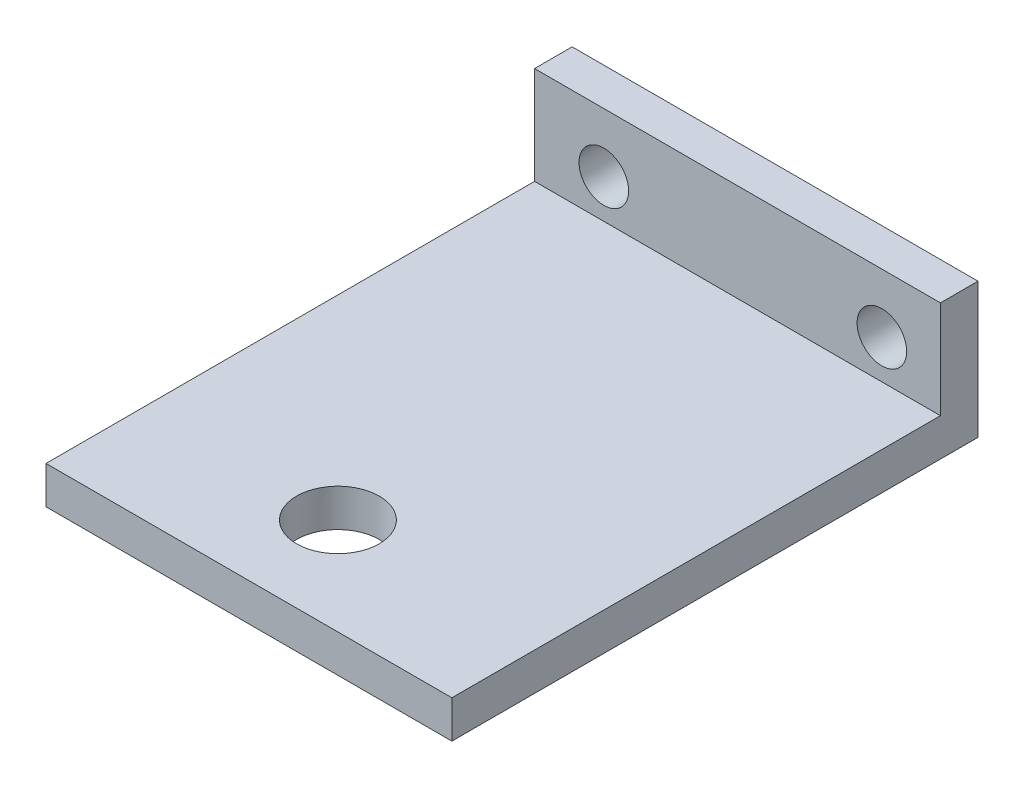
ISO-10303-21;
HEADER;
FILE_DESCRIPTION(('STEP AP214'),'2;1');
FILE_NAME('part.step','',(''),(''),'','','');
FILE_SCHEMA(('AUTOMOTIVE_DESIGN { 1 0 10303 214 1 1 1 1 }'));
ENDSEC;
DATA;
#1=APPLICATION_CONTEXT('core data for automotive mechanical design processes');
#2=APPLICATION_PROTOCOL_DEFINITION('international standard','automotive_design',2000,#1);
#3=PRODUCT_CONTEXT('',#1,'mechanical');
#4=PRODUCT('Part','Part','',(#3));
#5=PRODUCT_RELATED_PRODUCT_CATEGORY('part','',(#4));
#6=PRODUCT_DEFINITION_FORMATION('','',#4);
#7=PRODUCT_DEFINITION_CONTEXT('part definition',#1,'design');
#8=PRODUCT_DEFINITION('design','',#6,#7);
#9=PRODUCT_DEFINITION_SHAPE('','',#8);
#10=(LENGTH_UNIT() NAMED_UNIT(*) SI_UNIT(.MILLI.,.METRE.));
#11=(NAMED_UNIT(*) PLANE_ANGLE_UNIT() SI_UNIT($,.RADIAN.));
#12=(NAMED_UNIT(*) SI_UNIT($,.STERADIAN.) SOLID_ANGLE_UNIT());
#13=UNCERTAINTY_MEASURE_WITH_UNIT(LENGTH_MEASURE(1.E-05),#10,'distance_accuracy_value','');
#14=(GEOMETRIC_REPRESENTATION_CONTEXT(3) GLOBAL_UNCERTAINTY_ASSIGNED_CONTEXT((#13)) GLOBAL_UNIT_ASSIGNED_CONTEXT((#10,
#11,#12)) REPRESENTATION_CONTEXT('',''));
#15=CARTESIAN_POINT('',(0.,0.,0.));
#16=DIRECTION('',(0.,0.,1.));
#17=DIRECTION('',(1.,0.,0.));
#18=AXIS2_PLACEMENT_3D('',#15,#16,#17);
#19=CARTESIAN_POINT('',(0.,0.,70.));
#20=DIRECTION('',(0.,0.,-1.));
#21=DIRECTION('',(-1.,0.,0.));
#22=AXIS2_PLACEMENT_3D('',#19,#20,#21);
#23=PLANE('',#22);
#24=DIRECTION('',(1.,0.,0.));
#25=VECTOR('',#24,1.);
#26=CARTESIAN_POINT('',(0.,-4.,70.));
#27=LINE('',#26,#25);
#28=CARTESIAN_POINT('',(-27.,-4.,70.));
#29=VERTEX_POINT('',#28);
#30=CARTESIAN_POINT('',(27.,-4.,70.));
#31=VERTEX_POINT('',#30);
#32=EDGE_CURVE('E43',#29,#31,#27,.T.);
#33=ORIENTED_EDGE('',*,*,#32,.F.);
#34=DIRECTION('',(0.,-1.,0.));
#35=VECTOR('',#34,1.);
#36=CARTESIAN_POINT('',(-27.,-8.99999999999999,70.));
#37=LINE('',#36,#35);
#38=CARTESIAN_POINT('',(-27.,-8.99999999999999,70.));
#39=VERTEX_POINT('',#38);
#40=EDGE_CURVE('E123',#29,#39,#37,.T.);
#41=ORIENTED_EDGE('',*,*,#40,.T.);
#42=DIRECTION('',(1.,0.,0.));
#43=VECTOR('',#42,1.);
#44=CARTESIAN_POINT('',(-27.,-8.99999999999999,70.));
#45=LINE('',#44,#43);
#46=CARTESIAN_POINT('',(27.,-8.99999999999999,70.));
#47=VERTEX_POINT('',#46);
#48=EDGE_CURVE('E59',#39,#47,#45,.T.);
#49=ORIENTED_EDGE('',*,*,#48,.T.);
#50=DIRECTION('',(0.,1.,0.));
#51=VECTOR('',#50,1.);
#52=CARTESIAN_POINT('',(27.,-8.99999999999999,70.));
#53=LINE('',#52,#51);
#54=EDGE_CURVE('E88',#47,#31,#53,.T.);
#55=ORIENTED_EDGE('',*,*,#54,.T.);
#56=EDGE_LOOP('',(#33,#41,#49,#55));
#57=FACE_BOUND('',#56,.T.);
#58=ADVANCED_FACE('F35',(#57),#23,.F.);
#59=CARTESIAN_POINT('',(27.,-8.99999999999999,70.));
#60=DIRECTION('',(-1.,0.,0.));
#61=DIRECTION('',(0.,0.,1.));
#62=AXIS2_PLACEMENT_3D('',#59,#60,#61);
#63=PLANE('',#62);
#64=DIRECTION('',(0.,0.,-1.));
#65=VECTOR('',#64,1.);
#66=CARTESIAN_POINT('',(27.,9.,70.));
#67=LINE('',#66,#65);
#68=CARTESIAN_POINT('',(27.,9.,5.));
#69=VERTEX_POINT('',#68);
#70=CARTESIAN_POINT('',(27.,9.,0.));
#71=VERTEX_POINT('',#70);
#72=EDGE_CURVE('E114',#69,#71,#67,.T.);
#73=ORIENTED_EDGE('',*,*,#72,.F.);
#74=DIRECTION('',(0.,-1.,0.));
#75=VECTOR('',#74,1.);
#76=CARTESIAN_POINT('',(27.,-8.99999999999999,5.));
#77=LINE('',#76,#75);
#78=CARTESIAN_POINT('',(27.,-4.,5.));
#79=VERTEX_POINT('',#78);
#80=EDGE_CURVE('E101',#69,#79,#77,.T.);
#81=ORIENTED_EDGE('',*,*,#80,.T.);
#82=DIRECTION('',(0.,0.,-1.));
#83=VECTOR('',#82,1.);
#84=CARTESIAN_POINT('',(27.,-4.,70.));
#85=LINE('',#84,#83);
#86=EDGE_CURVE('E105',#31,#79,#85,.T.);
#87=ORIENTED_EDGE('',*,*,#86,.F.);
#88=ORIENTED_EDGE('',*,*,#54,.F.);
#89=DIRECTION('',(0.,0.,-1.));
#90=VECTOR('',#89,1.);
#91=CARTESIAN_POINT('',(27.,-8.99999999999999,70.));
#92=LINE('',#91,#90);
#93=CARTESIAN_POINT('',(27.,-8.99999999999999,0.));
#94=VERTEX_POINT('',#93);
#95=EDGE_CURVE('E81',#47,#94,#92,.T.);
#96=ORIENTED_EDGE('',*,*,#95,.T.);
#97=DIRECTION('',(0.,1.,0.));
#98=VECTOR('',#97,1.);
#99=CARTESIAN_POINT('',(27.,-8.99999999999999,0.));
#100=LINE('',#99,#98);
#101=EDGE_CURVE('E94',#94,#71,#100,.T.);
#102=ORIENTED_EDGE('',*,*,#101,.T.);
#103=EDGE_LOOP('',(#73,#81,#87,#88,#96,#102));
#104=FACE_BOUND('',#103,.T.);
#105=ADVANCED_FACE('F37',(#104),#63,.F.);
#106=CARTESIAN_POINT('',(-27.,9.,70.));
#107=DIRECTION('',(0.,-1.,0.));
#108=DIRECTION('',(0.,0.,-1.));
#109=AXIS2_PLACEMENT_3D('',#106,#107,#108);
#110=PLANE('',#109);
#111=DIRECTION('',(0.,0.,-1.));
#112=VECTOR('',#111,1.);
#113=CARTESIAN_POINT('',(-27.,9.,70.));
#114=LINE('',#113,#112);
#115=CARTESIAN_POINT('',(-27.,9.,5.));
#116=VERTEX_POINT('',#115);
#117=CARTESIAN_POINT('',(-27.,9.,0.));
#118=VERTEX_POINT('',#117);
#119=EDGE_CURVE('E112',#116,#118,#114,.T.);
#120=ORIENTED_EDGE('',*,*,#119,.F.);
#121=DIRECTION('',(-1.,0.,0.));
#122=VECTOR('',#121,1.);
#123=CARTESIAN_POINT('',(42.5059230736906,9.,5.));
#124=LINE('',#123,#122);
#125=EDGE_CURVE('E128',#69,#116,#124,.T.);
#126=ORIENTED_EDGE('',*,*,#125,.F.);
#127=ORIENTED_EDGE('',*,*,#72,.T.);
#128=DIRECTION('',(-1.,0.,0.));
#129=VECTOR('',#128,1.);
#130=CARTESIAN_POINT('',(-27.,9.,0.));
#131=LINE('',#130,#129);
#132=EDGE_CURVE('E100',#71,#118,#131,.T.);
#133=ORIENTED_EDGE('',*,*,#132,.T.);
#134=EDGE_LOOP('',(#120,#126,#127,#133));
#135=FACE_BOUND('',#134,.T.);
#136=ADVANCED_FACE('F165',(#135),#110,.F.);
#137=CARTESIAN_POINT('',(-27.,-8.99999999999999,70.));
#138=DIRECTION('',(1.,0.,0.));
#139=DIRECTION('',(0.,0.,-1.));
#140=AXIS2_PLACEMENT_3D('',#137,#138,#139);
#141=PLANE('',#140);
#142=DIRECTION('',(0.,0.,1.));
#143=VECTOR('',#142,1.);
#144=CARTESIAN_POINT('',(-27.,-4.,70.));
#145=LINE('',#144,#143);
#146=CARTESIAN_POINT('',(-27.,-4.,5.));
#147=VERTEX_POINT('',#146);
#148=EDGE_CURVE('E50',#147,#29,#145,.T.);
#149=ORIENTED_EDGE('',*,*,#148,.F.);
#150=DIRECTION('',(0.,1.,0.));
#151=VECTOR('',#150,1.);
#152=CARTESIAN_POINT('',(-27.,-8.99999999999999,5.));
#153=LINE('',#152,#151);
#154=EDGE_CURVE('E11',#147,#116,#153,.T.);
#155=ORIENTED_EDGE('',*,*,#154,.T.);
#156=ORIENTED_EDGE('',*,*,#119,.T.);
#157=DIRECTION('',(0.,-1.,0.));
#158=VECTOR('',#157,1.);
#159=CARTESIAN_POINT('',(-27.,-8.99999999999999,0.));
#160=LINE('',#159,#158);
#161=CARTESIAN_POINT('',(-27.,-8.99999999999999,0.));
#162=VERTEX_POINT('',#161);
#163=EDGE_CURVE('E89',#118,#162,#160,.T.);
#164=ORIENTED_EDGE('',*,*,#163,.T.);
#165=DIRECTION('',(0.,0.,-1.));
#166=VECTOR('',#165,1.);
#167=CARTESIAN_POINT('',(-27.,-8.99999999999999,70.));
#168=LINE('',#167,#166);
#169=EDGE_CURVE('E84',#39,#162,#168,.T.);
#170=ORIENTED_EDGE('',*,*,#169,.F.);
#171=ORIENTED_EDGE('',*,*,#40,.F.);
#172=EDGE_LOOP('',(#149,#155,#156,#164,#170,#171));
#173=FACE_BOUND('',#172,.T.);
#174=ADVANCED_FACE('F154',(#173),#141,.F.);
#175=CARTESIAN_POINT('',(-27.,-8.99999999999999,70.));
#176=DIRECTION('',(0.,1.,0.));
#177=DIRECTION('',(0.,0.,1.));
#178=AXIS2_PLACEMENT_3D('',#175,#176,#177);
#179=PLANE('',#178);
#180=CARTESIAN_POINT('',(-1.0698050600705,-8.99999999999999,57.0922104987842));
#181=DIRECTION('',(0.,-1.,0.));
#182=DIRECTION('',(0.,0.,-1.));
#183=AXIS2_PLACEMENT_3D('',#180,#181,#182);
#184=CIRCLE('',#183,5.5);
#185=CARTESIAN_POINT('',(-1.0698050600705,-8.99999999999999,51.5922104987842));
#186=VERTEX_POINT('',#185);
#187=EDGE_CURVE('E147',#186,#186,#184,.T.);
#188=ORIENTED_EDGE('',*,*,#187,.F.);
#189=EDGE_LOOP('',(#188));
#190=FACE_BOUND('',#189,.T.);
#191=DIRECTION('',(1.,0.,0.));
#192=VECTOR('',#191,1.);
#193=CARTESIAN_POINT('',(-27.,-8.99999999999999,0.));
#194=LINE('',#193,#192);
#195=EDGE_CURVE('E78',#162,#94,#194,.T.);
#196=ORIENTED_EDGE('',*,*,#195,.T.);
#197=ORIENTED_EDGE('',*,*,#95,.F.);
#198=ORIENTED_EDGE('',*,*,#48,.F.);
#199=ORIENTED_EDGE('',*,*,#169,.T.);
#200=EDGE_LOOP('',(#196,#197,#198,#199));
#201=FACE_BOUND('',#200,.T.);
#202=ADVANCED_FACE('F80',(#190,#201),#179,.F.);
#203=CARTESIAN_POINT('',(0.,0.,0.));
#204=DIRECTION('',(0.,0.,-1.));
#205=DIRECTION('',(-1.,0.,0.));
#206=AXIS2_PLACEMENT_3D('',#203,#204,#205);
#207=PLANE('',#206);
#208=CARTESIAN_POINT('',(19.2116306925207,1.14474678496368,0.));
#209=DIRECTION('',(0.,0.,1.));
#210=DIRECTION('',(1.,0.,0.));
#211=AXIS2_PLACEMENT_3D('',#208,#209,#210);
#212=CIRCLE('',#211,3.3);
#213=CARTESIAN_POINT('',(22.5116306925207,1.14474678496368,0.));
#214=VERTEX_POINT('',#213);
#215=EDGE_CURVE('E138',#214,#214,#212,.T.);
#216=ORIENTED_EDGE('',*,*,#215,.T.);
#217=EDGE_LOOP('',(#216));
#218=FACE_BOUND('',#217,.T.);
#219=CARTESIAN_POINT('',(-17.7824036570975,1.14474678496368,0.));
#220=DIRECTION('',(0.,0.,1.));
#221=DIRECTION('',(1.,0.,0.));
#222=AXIS2_PLACEMENT_3D('',#219,#220,#221);
#223=CIRCLE('',#222,3.3);
#224=CARTESIAN_POINT('',(-14.4824036570975,1.14474678496368,0.));
#225=VERTEX_POINT('',#224);
#226=EDGE_CURVE('E131',#225,#225,#223,.T.);
#227=ORIENTED_EDGE('',*,*,#226,.T.);
#228=EDGE_LOOP('',(#227));
#229=FACE_BOUND('',#228,.T.);
#230=ORIENTED_EDGE('',*,*,#101,.F.);
#231=ORIENTED_EDGE('',*,*,#195,.F.);
#232=ORIENTED_EDGE('',*,*,#163,.F.);
#233=ORIENTED_EDGE('',*,*,#132,.F.);
#234=EDGE_LOOP('',(#230,#231,#232,#233));
#235=FACE_BOUND('',#234,.T.);
#236=ADVANCED_FACE('F98',(#218,#229,#235),#207,.T.);
#237=CARTESIAN_POINT('',(42.5059230736906,-4.,5.));
#238=DIRECTION('',(0.,0.,-1.));
#239=DIRECTION('',(-1.,0.,0.));
#240=AXIS2_PLACEMENT_3D('',#237,#238,#239);
#241=PLANE('',#240);
#242=CARTESIAN_POINT('',(19.2116306925207,1.14474678496368,5.));
#243=DIRECTION('',(0.,0.,1.));
#244=DIRECTION('',(1.,0.,0.));
#245=AXIS2_PLACEMENT_3D('',#242,#243,#244);
#246=CIRCLE('',#245,3.29999999999999);
#247=CARTESIAN_POINT('',(22.5116306925207,1.14474678496368,5.));
#248=VERTEX_POINT('',#247);
#249=EDGE_CURVE('E141',#248,#248,#246,.T.);
#250=ORIENTED_EDGE('',*,*,#249,.F.);
#251=EDGE_LOOP('',(#250));
#252=FACE_BOUND('',#251,.T.);
#253=CARTESIAN_POINT('',(-17.7824036570975,1.14474678496368,5.));
#254=DIRECTION('',(0.,0.,1.));
#255=DIRECTION('',(1.,0.,0.));
#256=AXIS2_PLACEMENT_3D('',#253,#254,#255);
#257=CIRCLE('',#256,3.29999999999999);
#258=CARTESIAN_POINT('',(-14.4824036570975,1.14474678496368,5.));
#259=VERTEX_POINT('',#258);
#260=EDGE_CURVE('E135',#259,#259,#257,.T.);
#261=ORIENTED_EDGE('',*,*,#260,.F.);
#262=EDGE_LOOP('',(#261));
#263=FACE_BOUND('',#262,.T.);
#264=ORIENTED_EDGE('',*,*,#125,.T.);
#265=ORIENTED_EDGE('',*,*,#154,.F.);
#266=DIRECTION('',(-1.,0.,0.));
#267=VECTOR('',#266,1.);
#268=CARTESIAN_POINT('',(42.5059230736906,-4.,5.));
#269=LINE('',#268,#267);
#270=EDGE_CURVE('E127',#79,#147,#269,.T.);
#271=ORIENTED_EDGE('',*,*,#270,.F.);
#272=ORIENTED_EDGE('',*,*,#80,.F.);
#273=EDGE_LOOP('',(#264,#265,#271,#272));
#274=FACE_BOUND('',#273,.T.);
#275=ADVANCED_FACE('F161',(#252,#263,#274),#241,.F.);
#276=CARTESIAN_POINT('',(0.,-4.,0.));
#277=DIRECTION('',(0.,1.,0.));
#278=DIRECTION('',(0.,0.,1.));
#279=AXIS2_PLACEMENT_3D('',#276,#277,#278);
#280=PLANE('',#279);
#281=CARTESIAN_POINT('',(-1.0698050600705,-4.,57.0922104987842));
#282=DIRECTION('',(0.,1.,0.));
#283=DIRECTION('',(0.,0.,1.));
#284=AXIS2_PLACEMENT_3D('',#281,#282,#283);
#285=CIRCLE('',#284,5.5);
#286=CARTESIAN_POINT('',(-1.0698050600705,-4.,62.5922104987842));
#287=VERTEX_POINT('',#286);
#288=EDGE_CURVE('E144',#287,#287,#285,.T.);
#289=ORIENTED_EDGE('',*,*,#288,.F.);
#290=EDGE_LOOP('',(#289));
#291=FACE_BOUND('',#290,.T.);
#292=ORIENTED_EDGE('',*,*,#86,.T.);
#293=ORIENTED_EDGE('',*,*,#270,.T.);
#294=ORIENTED_EDGE('',*,*,#148,.T.);
#295=ORIENTED_EDGE('',*,*,#32,.T.);
#296=EDGE_LOOP('',(#292,#293,#294,#295));
#297=FACE_BOUND('',#296,.T.);
#298=ADVANCED_FACE('F116',(#291,#297),#280,.T.);
#299=CARTESIAN_POINT('',(-17.7824036570975,1.14474678496368,5.));
#300=DIRECTION('',(0.,0.,1.));
#301=DIRECTION('',(1.,0.,0.));
#302=AXIS2_PLACEMENT_3D('',#299,#300,#301);
#303=CYLINDRICAL_SURFACE('',#302,3.29999999999999);
#304=ORIENTED_EDGE('',*,*,#226,.F.);
#305=EDGE_LOOP('',(#304));
#306=FACE_BOUND('',#305,.T.);
#307=ORIENTED_EDGE('',*,*,#260,.T.);
#308=EDGE_LOOP('',(#307));
#309=FACE_BOUND('',#308,.T.);
#310=ADVANCED_FACE('F178',(#306,#309),#303,.F.);
#311=CARTESIAN_POINT('',(19.2116306925207,1.14474678496368,5.));
#312=DIRECTION('',(0.,0.,1.));
#313=DIRECTION('',(1.,0.,0.));
#314=AXIS2_PLACEMENT_3D('',#311,#312,#313);
#315=CYLINDRICAL_SURFACE('',#314,3.29999999999999);
#316=ORIENTED_EDGE('',*,*,#215,.F.);
#317=EDGE_LOOP('',(#316));
#318=FACE_BOUND('',#317,.T.);
#319=ORIENTED_EDGE('',*,*,#249,.T.);
#320=EDGE_LOOP('',(#319));
#321=FACE_BOUND('',#320,.T.);
#322=ADVANCED_FACE('F182',(#318,#321),#315,.F.);
#323=CARTESIAN_POINT('',(-1.0698050600705,-8.99999999999999,57.0922104987842));
#324=DIRECTION('',(0.,-1.,0.));
#325=DIRECTION('',(0.,0.,-1.));
#326=AXIS2_PLACEMENT_3D('',#323,#324,#325);
#327=CYLINDRICAL_SURFACE('',#326,5.5);
#328=ORIENTED_EDGE('',*,*,#288,.T.);
#329=EDGE_LOOP('',(#328));
#330=FACE_BOUND('',#329,.T.);
#331=ORIENTED_EDGE('',*,*,#187,.T.);
#332=EDGE_LOOP('',(#331));
#333=FACE_BOUND('',#332,.T.);
#334=ADVANCED_FACE('F151',(#330,#333),#327,.F.);
#335=CLOSED_SHELL('',(#58,#105,#136,#174,#202,#236,#275,#298,#310,#322,#334));
#336=MANIFOLD_SOLID_BREP('B2',#335);
#337=ADVANCED_BREP_SHAPE_REPRESENTATION('',(#18,#336),#14);
#338=SHAPE_DEFINITION_REPRESENTATION(#9,#337);
ENDSEC;
END-ISO-10303-21;
